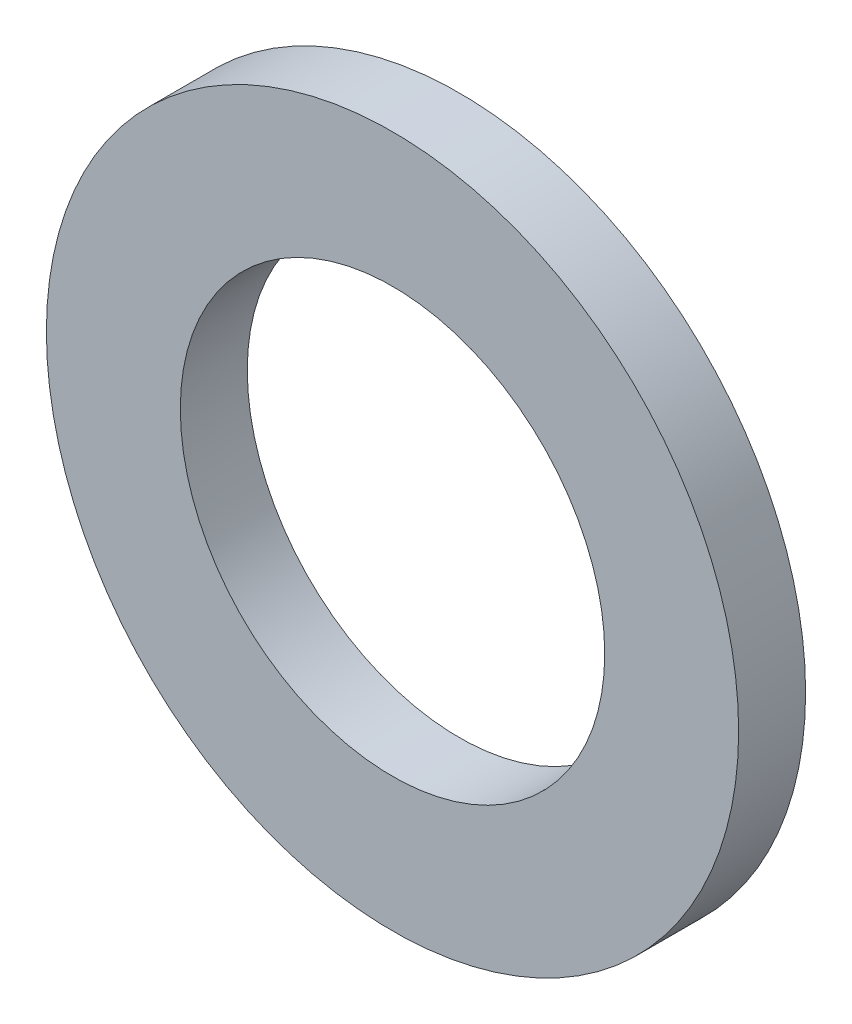
ISO-10303-21;
HEADER;
FILE_DESCRIPTION(('STEP AP214'),'2;1');
FILE_NAME('part.step','',(''),(''),'','','');
FILE_SCHEMA(('AUTOMOTIVE_DESIGN { 1 0 10303 214 1 1 1 1 }'));
ENDSEC;
DATA;
#1=APPLICATION_CONTEXT('core data for automotive mechanical design processes');
#2=APPLICATION_PROTOCOL_DEFINITION('international standard','automotive_design',2000,#1);
#3=PRODUCT_CONTEXT('',#1,'mechanical');
#4=PRODUCT('Part','Part','',(#3));
#5=PRODUCT_RELATED_PRODUCT_CATEGORY('part','',(#4));
#6=PRODUCT_DEFINITION_FORMATION('','',#4);
#7=PRODUCT_DEFINITION_CONTEXT('part definition',#1,'design');
#8=PRODUCT_DEFINITION('design','',#6,#7);
#9=PRODUCT_DEFINITION_SHAPE('','',#8);
#10=(LENGTH_UNIT() NAMED_UNIT(*) SI_UNIT(.MILLI.,.METRE.));
#11=(NAMED_UNIT(*) PLANE_ANGLE_UNIT() SI_UNIT($,.RADIAN.));
#12=(NAMED_UNIT(*) SI_UNIT($,.STERADIAN.) SOLID_ANGLE_UNIT());
#13=UNCERTAINTY_MEASURE_WITH_UNIT(LENGTH_MEASURE(1.E-05),#10,'distance_accuracy_value','');
#14=(GEOMETRIC_REPRESENTATION_CONTEXT(3) GLOBAL_UNCERTAINTY_ASSIGNED_CONTEXT((#13)) GLOBAL_UNIT_ASSIGNED_CONTEXT((#10,
#11,#12)) REPRESENTATION_CONTEXT('',''));
#15=CARTESIAN_POINT('',(0.,0.,0.));
#16=DIRECTION('',(0.,0.,1.));
#17=DIRECTION('',(1.,0.,0.));
#18=AXIS2_PLACEMENT_3D('',#15,#16,#17);
#19=CARTESIAN_POINT('',(0.,0.,1.27));
#20=DIRECTION('',(0.,0.,1.));
#21=DIRECTION('',(1.,0.,0.));
#22=AXIS2_PLACEMENT_3D('',#19,#20,#21);
#23=PLANE('',#22);
#24=CARTESIAN_POINT('',(0.,0.,1.27));
#25=DIRECTION('',(0.,0.,1.));
#26=DIRECTION('',(1.,0.,0.));
#27=AXIS2_PLACEMENT_3D('',#24,#25,#26);
#28=CIRCLE('',#27,6.565);
#29=CARTESIAN_POINT('',(6.565,0.,1.27));
#30=VERTEX_POINT('',#29);
#31=EDGE_CURVE('E10',#30,#30,#28,.T.);
#32=ORIENTED_EDGE('',*,*,#31,.T.);
#33=EDGE_LOOP('',(#32));
#34=FACE_BOUND('',#33,.T.);
#35=CARTESIAN_POINT('',(0.,0.,1.27));
#36=DIRECTION('',(0.,0.,1.));
#37=DIRECTION('',(1.,0.,0.));
#38=AXIS2_PLACEMENT_3D('',#35,#36,#37);
#39=CIRCLE('',#38,4.025);
#40=CARTESIAN_POINT('',(4.025,0.,1.27));
#41=VERTEX_POINT('',#40);
#42=EDGE_CURVE('E50',#41,#41,#39,.T.);
#43=ORIENTED_EDGE('',*,*,#42,.F.);
#44=EDGE_LOOP('',(#43));
#45=FACE_BOUND('',#44,.T.);
#46=ADVANCED_FACE('F39',(#34,#45),#23,.T.);
#47=CARTESIAN_POINT('',(0.,0.,0.));
#48=DIRECTION('',(0.,0.,1.));
#49=DIRECTION('',(1.,0.,0.));
#50=AXIS2_PLACEMENT_3D('',#47,#48,#49);
#51=PLANE('',#50);
#52=CARTESIAN_POINT('',(0.,0.,0.));
#53=DIRECTION('',(0.,0.,1.));
#54=DIRECTION('',(1.,0.,0.));
#55=AXIS2_PLACEMENT_3D('',#52,#53,#54);
#56=CIRCLE('',#55,6.565);
#57=CARTESIAN_POINT('',(6.565,0.,0.));
#58=VERTEX_POINT('',#57);
#59=EDGE_CURVE('E43',#58,#58,#56,.T.);
#60=ORIENTED_EDGE('',*,*,#59,.F.);
#61=EDGE_LOOP('',(#60));
#62=FACE_BOUND('',#61,.T.);
#63=CARTESIAN_POINT('',(0.,0.,0.));
#64=DIRECTION('',(0.,0.,1.));
#65=DIRECTION('',(1.,0.,0.));
#66=AXIS2_PLACEMENT_3D('',#63,#64,#65);
#67=CIRCLE('',#66,4.025);
#68=CARTESIAN_POINT('',(4.025,0.,0.));
#69=VERTEX_POINT('',#68);
#70=EDGE_CURVE('E52',#69,#69,#67,.T.);
#71=ORIENTED_EDGE('',*,*,#70,.T.);
#72=EDGE_LOOP('',(#71));
#73=FACE_BOUND('',#72,.T.);
#74=ADVANCED_FACE('F62',(#62,#73),#51,.F.);
#75=CARTESIAN_POINT('',(0.,0.,1.27));
#76=DIRECTION('',(0.,0.,-1.));
#77=DIRECTION('',(-1.,0.,0.));
#78=AXIS2_PLACEMENT_3D('',#75,#76,#77);
#79=CYLINDRICAL_SURFACE('',#78,6.565);
#80=ORIENTED_EDGE('',*,*,#31,.F.);
#81=EDGE_LOOP('',(#80));
#82=FACE_BOUND('',#81,.T.);
#83=ORIENTED_EDGE('',*,*,#59,.T.);
#84=EDGE_LOOP('',(#83));
#85=FACE_BOUND('',#84,.T.);
#86=ADVANCED_FACE('F41',(#82,#85),#79,.T.);
#87=CARTESIAN_POINT('',(0.,0.,1.27));
#88=DIRECTION('',(0.,0.,-1.));
#89=DIRECTION('',(-1.,0.,0.));
#90=AXIS2_PLACEMENT_3D('',#87,#88,#89);
#91=CYLINDRICAL_SURFACE('',#90,4.025);
#92=ORIENTED_EDGE('',*,*,#42,.T.);
#93=EDGE_LOOP('',(#92));
#94=FACE_BOUND('',#93,.T.);
#95=ORIENTED_EDGE('',*,*,#70,.F.);
#96=EDGE_LOOP('',(#95));
#97=FACE_BOUND('',#96,.T.);
#98=ADVANCED_FACE('F58',(#94,#97),#91,.F.);
#99=CLOSED_SHELL('',(#46,#74,#86,#98));
#100=MANIFOLD_SOLID_BREP('B2',#99);
#101=ADVANCED_BREP_SHAPE_REPRESENTATION('',(#18,#100),#14);
#102=SHAPE_DEFINITION_REPRESENTATION(#9,#101);
ENDSEC;
END-ISO-10303-21;
